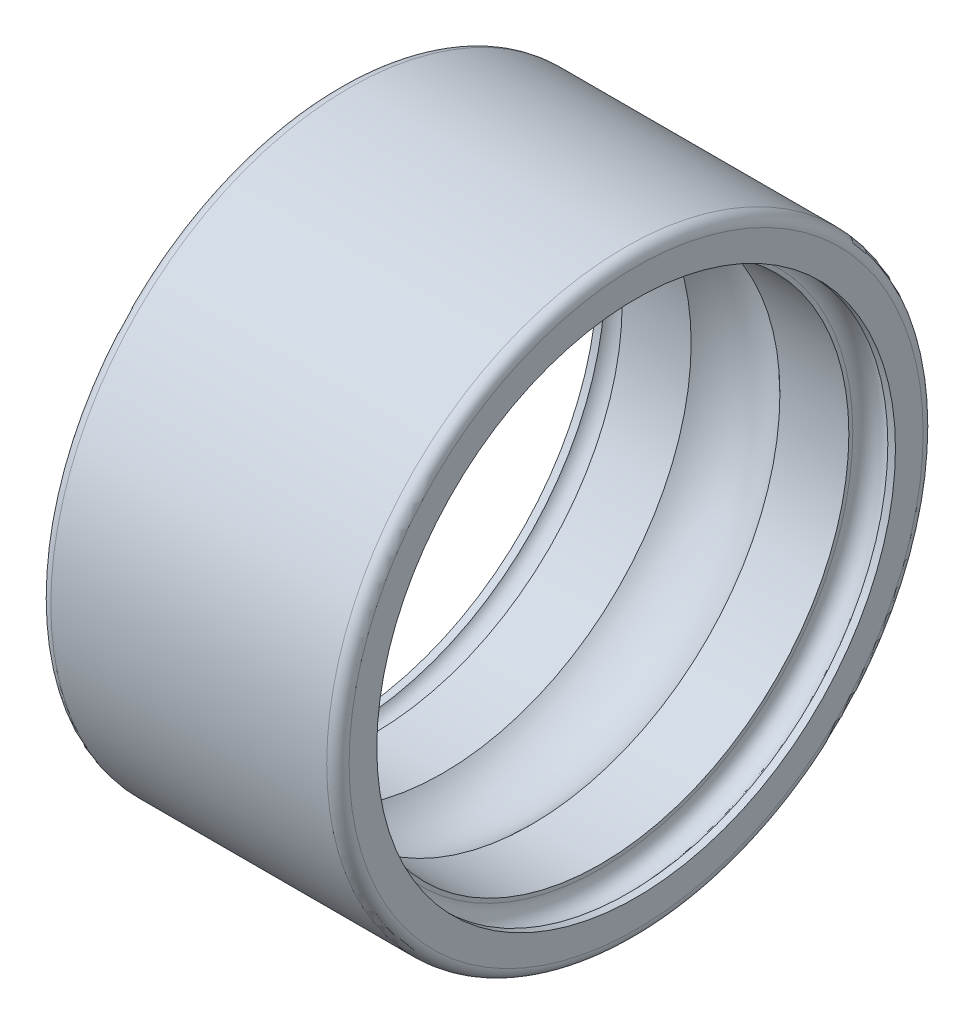
ISO-10303-21;
HEADER;
FILE_DESCRIPTION(('STEP AP214'),'2;1');
FILE_NAME('part.step','',(''),(''),'','','');
FILE_SCHEMA(('AUTOMOTIVE_DESIGN { 1 0 10303 214 1 1 1 1 }'));
ENDSEC;
DATA;
#1=APPLICATION_CONTEXT('core data for automotive mechanical design processes');
#2=APPLICATION_PROTOCOL_DEFINITION('international standard','automotive_design',2000,#1);
#3=PRODUCT_CONTEXT('',#1,'mechanical');
#4=PRODUCT('Part','Part','',(#3));
#5=PRODUCT_RELATED_PRODUCT_CATEGORY('part','',(#4));
#6=PRODUCT_DEFINITION_FORMATION('','',#4);
#7=PRODUCT_DEFINITION_CONTEXT('part definition',#1,'design');
#8=PRODUCT_DEFINITION('design','',#6,#7);
#9=PRODUCT_DEFINITION_SHAPE('','',#8);
#10=(LENGTH_UNIT() NAMED_UNIT(*) SI_UNIT(.MILLI.,.METRE.));
#11=(NAMED_UNIT(*) PLANE_ANGLE_UNIT() SI_UNIT($,.RADIAN.));
#12=(NAMED_UNIT(*) SI_UNIT($,.STERADIAN.) SOLID_ANGLE_UNIT());
#13=UNCERTAINTY_MEASURE_WITH_UNIT(LENGTH_MEASURE(1.E-05),#10,'distance_accuracy_value','');
#14=(GEOMETRIC_REPRESENTATION_CONTEXT(3) GLOBAL_UNCERTAINTY_ASSIGNED_CONTEXT((#13)) GLOBAL_UNIT_ASSIGNED_CONTEXT((#10,
#11,#12)) REPRESENTATION_CONTEXT('',''));
#15=CARTESIAN_POINT('',(0.,0.,0.));
#16=DIRECTION('',(0.,0.,1.));
#17=DIRECTION('',(1.,0.,0.));
#18=AXIS2_PLACEMENT_3D('',#15,#16,#17);
#19=CARTESIAN_POINT('',(0.,0.,0.));
#20=DIRECTION('',(-1.,0.,0.));
#21=DIRECTION('',(0.,0.,1.));
#22=AXIS2_PLACEMENT_3D('',#19,#20,#21);
#23=CYLINDRICAL_SURFACE('',#22,3.33333333333333);
#24=CARTESIAN_POINT('',(2.5951190357119,0.,0.));
#25=DIRECTION('',(-1.,0.,0.));
#26=DIRECTION('',(0.,0.,1.));
#27=AXIS2_PLACEMENT_3D('',#24,#25,#26);
#28=CIRCLE('',#27,3.33333333333333);
#29=CARTESIAN_POINT('',(2.5951190357119,0.,3.33333333333333));
#30=VERTEX_POINT('',#29);
#31=EDGE_CURVE('E45',#30,#30,#28,.T.);
#32=ORIENTED_EDGE('',*,*,#31,.T.);
#33=EDGE_LOOP('',(#32));
#34=FACE_BOUND('',#33,.T.);
#35=CARTESIAN_POINT('',(3.52,0.,0.));
#36=DIRECTION('',(1.,0.,0.));
#37=DIRECTION('',(0.,0.,-1.));
#38=AXIS2_PLACEMENT_3D('',#35,#36,#37);
#39=CIRCLE('',#38,3.33333333333333);
#40=CARTESIAN_POINT('',(3.52,0.,-3.33333333333333));
#41=VERTEX_POINT('',#40);
#42=EDGE_CURVE('E18',#41,#41,#39,.T.);
#43=ORIENTED_EDGE('',*,*,#42,.T.);
#44=EDGE_LOOP('',(#43));
#45=FACE_BOUND('',#44,.T.);
#46=ADVANCED_FACE('F15',(#34,#45),#23,.F.);
#47=CARTESIAN_POINT('',(0.,0.,0.));
#48=DIRECTION('',(-1.,0.,0.));
#49=DIRECTION('',(0.,0.,1.));
#50=AXIS2_PLACEMENT_3D('',#47,#48,#49);
#51=CYLINDRICAL_SURFACE('',#50,3.33333333333333);
#52=CARTESIAN_POINT('',(1.4048809642881,0.,0.));
#53=DIRECTION('',(-1.,0.,0.));
#54=DIRECTION('',(0.,0.,1.));
#55=AXIS2_PLACEMENT_3D('',#52,#53,#54);
#56=CIRCLE('',#55,3.33333333333333);
#57=CARTESIAN_POINT('',(1.4048809642881,0.,3.33333333333333));
#58=VERTEX_POINT('',#57);
#59=EDGE_CURVE('E78',#58,#58,#56,.T.);
#60=ORIENTED_EDGE('',*,*,#59,.F.);
#61=EDGE_LOOP('',(#60));
#62=FACE_BOUND('',#61,.T.);
#63=CARTESIAN_POINT('',(0.48,0.,0.));
#64=DIRECTION('',(-1.,0.,0.));
#65=DIRECTION('',(0.,0.,1.));
#66=AXIS2_PLACEMENT_3D('',#63,#64,#65);
#67=CIRCLE('',#66,3.33333333333333);
#68=CARTESIAN_POINT('',(0.48,0.,3.33333333333333));
#69=VERTEX_POINT('',#68);
#70=EDGE_CURVE('E37',#69,#69,#67,.F.);
#71=ORIENTED_EDGE('',*,*,#70,.F.);
#72=EDGE_LOOP('',(#71));
#73=FACE_BOUND('',#72,.T.);
#74=ADVANCED_FACE('F108',(#62,#73),#51,.F.);
#75=CARTESIAN_POINT('',(4.,3.33333333333333,0.));
#76=DIRECTION('',(-1.,0.,0.));
#77=DIRECTION('',(0.,0.,1.));
#78=AXIS2_PLACEMENT_3D('',#75,#76,#77);
#79=PLANE('',#78);
#80=CARTESIAN_POINT('',(4.,0.,0.));
#81=DIRECTION('',(-1.,0.,0.));
#82=DIRECTION('',(0.,0.,1.));
#83=AXIS2_PLACEMENT_3D('',#80,#81,#82);
#84=CIRCLE('',#83,3.47833333333333);
#85=CARTESIAN_POINT('',(4.,0.,3.47833333333334));
#86=VERTEX_POINT('',#85);
#87=EDGE_CURVE('E46',#86,#86,#84,.T.);
#88=ORIENTED_EDGE('',*,*,#87,.T.);
#89=EDGE_LOOP('',(#88));
#90=FACE_BOUND('',#89,.T.);
#91=CARTESIAN_POINT('',(4.,0.,0.));
#92=DIRECTION('',(-1.,0.,0.));
#93=DIRECTION('',(0.,0.,1.));
#94=AXIS2_PLACEMENT_3D('',#91,#92,#93);
#95=CIRCLE('',#94,3.85);
#96=CARTESIAN_POINT('',(4.,0.,3.85));
#97=VERTEX_POINT('',#96);
#98=EDGE_CURVE('E10',#97,#97,#95,.T.);
#99=ORIENTED_EDGE('',*,*,#98,.F.);
#100=EDGE_LOOP('',(#99));
#101=FACE_BOUND('',#100,.T.);
#102=ADVANCED_FACE('F102',(#90,#101),#79,.F.);
#103=CARTESIAN_POINT('',(3.85,0.,0.));
#104=DIRECTION('',(-1.,0.,0.));
#105=DIRECTION('',(0.,0.,1.));
#106=AXIS2_PLACEMENT_3D('',#103,#104,#105);
#107=TOROIDAL_SURFACE('',#106,3.85,0.15);
#108=CARTESIAN_POINT('',(3.85,0.,0.));
#109=DIRECTION('',(-1.,0.,0.));
#110=DIRECTION('',(0.,0.,1.));
#111=AXIS2_PLACEMENT_3D('',#108,#109,#110);
#112=CIRCLE('',#111,4.);
#113=CARTESIAN_POINT('',(3.85,0.,4.));
#114=VERTEX_POINT('',#113);
#115=EDGE_CURVE('E23',#114,#114,#112,.T.);
#116=ORIENTED_EDGE('',*,*,#115,.F.);
#117=EDGE_LOOP('',(#116));
#118=FACE_BOUND('',#117,.T.);
#119=ORIENTED_EDGE('',*,*,#98,.T.);
#120=EDGE_LOOP('',(#119));
#121=FACE_BOUND('',#120,.T.);
#122=ADVANCED_FACE('F97',(#118,#121),#107,.T.);
#123=CARTESIAN_POINT('',(0.,0.,0.));
#124=DIRECTION('',(-1.,0.,0.));
#125=DIRECTION('',(0.,0.,1.));
#126=AXIS2_PLACEMENT_3D('',#123,#124,#125);
#127=CYLINDRICAL_SURFACE('',#126,4.);
#128=CARTESIAN_POINT('',(0.15,0.,0.));
#129=DIRECTION('',(-1.,0.,0.));
#130=DIRECTION('',(0.,0.,1.));
#131=AXIS2_PLACEMENT_3D('',#128,#129,#130);
#132=CIRCLE('',#131,4.);
#133=CARTESIAN_POINT('',(0.15,0.,4.));
#134=VERTEX_POINT('',#133);
#135=EDGE_CURVE('E33',#134,#134,#132,.T.);
#136=ORIENTED_EDGE('',*,*,#135,.F.);
#137=EDGE_LOOP('',(#136));
#138=FACE_BOUND('',#137,.T.);
#139=ORIENTED_EDGE('',*,*,#115,.T.);
#140=EDGE_LOOP('',(#139));
#141=FACE_BOUND('',#140,.T.);
#142=ADVANCED_FACE('F94',(#138,#141),#127,.T.);
#143=CARTESIAN_POINT('',(0.15,0.,0.));
#144=DIRECTION('',(-1.,0.,0.));
#145=DIRECTION('',(0.,0.,1.));
#146=AXIS2_PLACEMENT_3D('',#143,#144,#145);
#147=TOROIDAL_SURFACE('',#146,3.85,0.15);
#148=CARTESIAN_POINT('',(0.,0.,0.));
#149=DIRECTION('',(-1.,0.,0.));
#150=DIRECTION('',(0.,0.,1.));
#151=AXIS2_PLACEMENT_3D('',#148,#149,#150);
#152=CIRCLE('',#151,3.85);
#153=CARTESIAN_POINT('',(0.,0.,3.85));
#154=VERTEX_POINT('',#153);
#155=EDGE_CURVE('E82',#154,#154,#152,.T.);
#156=ORIENTED_EDGE('',*,*,#155,.F.);
#157=EDGE_LOOP('',(#156));
#158=FACE_BOUND('',#157,.T.);
#159=ORIENTED_EDGE('',*,*,#135,.T.);
#160=EDGE_LOOP('',(#159));
#161=FACE_BOUND('',#160,.T.);
#162=ADVANCED_FACE('F92',(#158,#161),#147,.T.);
#163=CARTESIAN_POINT('',(0.,3.33333333333333,0.));
#164=DIRECTION('',(-1.,0.,0.));
#165=DIRECTION('',(0.,0.,1.));
#166=AXIS2_PLACEMENT_3D('',#163,#164,#165);
#167=PLANE('',#166);
#168=CARTESIAN_POINT('',(0.,0.,0.));
#169=DIRECTION('',(-1.,0.,0.));
#170=DIRECTION('',(0.,0.,1.));
#171=AXIS2_PLACEMENT_3D('',#168,#169,#170);
#172=CIRCLE('',#171,3.47833333333333);
#173=CARTESIAN_POINT('',(0.,0.,3.47833333333333));
#174=VERTEX_POINT('',#173);
#175=EDGE_CURVE('E41',#174,#174,#172,.T.);
#176=ORIENTED_EDGE('',*,*,#175,.F.);
#177=EDGE_LOOP('',(#176));
#178=FACE_BOUND('',#177,.T.);
#179=ORIENTED_EDGE('',*,*,#155,.T.);
#180=EDGE_LOOP('',(#179));
#181=FACE_BOUND('',#180,.T.);
#182=ADVANCED_FACE('F148',(#178,#181),#167,.T.);
#183=CARTESIAN_POINT('',(2.,0.,0.));
#184=DIRECTION('',(-1.,0.,0.));
#185=DIRECTION('',(0.,0.,1.));
#186=AXIS2_PLACEMENT_3D('',#183,#184,#185);
#187=TOROIDAL_SURFACE('',#186,2.75,0.833333333333334);
#188=ORIENTED_EDGE('',*,*,#59,.T.);
#189=EDGE_LOOP('',(#188));
#190=FACE_BOUND('',#189,.T.);
#191=ORIENTED_EDGE('',*,*,#31,.F.);
#192=EDGE_LOOP('',(#191));
#193=FACE_BOUND('',#192,.T.);
#194=ADVANCED_FACE('F145',(#190,#193),#187,.F.);
#195=CARTESIAN_POINT('',(0.48,2.25189739793884,0.));
#196=DIRECTION('',(-1.,0.,0.));
#197=DIRECTION('',(0.,0.,1.));
#198=AXIS2_PLACEMENT_3D('',#195,#196,#197);
#199=PLANE('',#198);
#200=CARTESIAN_POINT('',(0.48,0.,0.));
#201=DIRECTION('',(-1.,0.,0.));
#202=DIRECTION('',(0.,0.,1.));
#203=AXIS2_PLACEMENT_3D('',#200,#201,#202);
#204=CIRCLE('',#203,3.38633333333333);
#205=CARTESIAN_POINT('',(0.48,0.,3.38633333333333));
#206=VERTEX_POINT('',#205);
#207=EDGE_CURVE('E42',#206,#206,#204,.T.);
#208=ORIENTED_EDGE('',*,*,#207,.T.);
#209=EDGE_LOOP('',(#208));
#210=FACE_BOUND('',#209,.T.);
#211=ORIENTED_EDGE('',*,*,#70,.T.);
#212=EDGE_LOOP('',(#211));
#213=FACE_BOUND('',#212,.T.);
#214=ADVANCED_FACE('F141',(#210,#213),#199,.T.);
#215=CARTESIAN_POINT('',(0.28,0.,0.));
#216=DIRECTION('',(-1.,0.,0.));
#217=DIRECTION('',(0.,0.,1.));
#218=AXIS2_PLACEMENT_3D('',#215,#216,#217);
#219=TOROIDAL_SURFACE('',#218,3.38633333333333,0.2);
#220=CARTESIAN_POINT('',(0.102416216956615,0.,0.));
#221=DIRECTION('',(-1.,0.,0.));
#222=DIRECTION('',(0.,0.,1.));
#223=AXIS2_PLACEMENT_3D('',#220,#221,#222);
#224=CIRCLE('',#223,3.47833333333333);
#225=CARTESIAN_POINT('',(0.102416216956615,0.,3.47833333333333));
#226=VERTEX_POINT('',#225);
#227=EDGE_CURVE('E55',#226,#226,#224,.T.);
#228=ORIENTED_EDGE('',*,*,#227,.T.);
#229=EDGE_LOOP('',(#228));
#230=FACE_BOUND('',#229,.T.);
#231=ORIENTED_EDGE('',*,*,#207,.F.);
#232=EDGE_LOOP('',(#231));
#233=FACE_BOUND('',#232,.T.);
#234=ADVANCED_FACE('F137',(#230,#233),#219,.F.);
#235=CARTESIAN_POINT('',(-1.,0.,0.));
#236=DIRECTION('',(-1.,0.,0.));
#237=DIRECTION('',(0.,0.,1.));
#238=AXIS2_PLACEMENT_3D('',#235,#236,#237);
#239=CYLINDRICAL_SURFACE('',#238,3.47833333333333);
#240=ORIENTED_EDGE('',*,*,#175,.T.);
#241=EDGE_LOOP('',(#240));
#242=FACE_BOUND('',#241,.T.);
#243=ORIENTED_EDGE('',*,*,#227,.F.);
#244=EDGE_LOOP('',(#243));
#245=FACE_BOUND('',#244,.T.);
#246=ADVANCED_FACE('F131',(#242,#245),#239,.F.);
#247=CARTESIAN_POINT('',(5.,0.,0.));
#248=DIRECTION('',(1.,0.,0.));
#249=DIRECTION('',(0.,0.,-1.));
#250=AXIS2_PLACEMENT_3D('',#247,#248,#249);
#251=CYLINDRICAL_SURFACE('',#250,3.47833333333333);
#252=CARTESIAN_POINT('',(3.89758378304338,0.,0.));
#253=DIRECTION('',(1.,0.,0.));
#254=DIRECTION('',(0.,0.,-1.));
#255=AXIS2_PLACEMENT_3D('',#252,#253,#254);
#256=CIRCLE('',#255,3.47833333333333);
#257=CARTESIAN_POINT('',(3.89758378304339,0.,-3.47833333333333));
#258=VERTEX_POINT('',#257);
#259=EDGE_CURVE('E58',#258,#258,#256,.T.);
#260=ORIENTED_EDGE('',*,*,#259,.F.);
#261=EDGE_LOOP('',(#260));
#262=FACE_BOUND('',#261,.T.);
#263=ORIENTED_EDGE('',*,*,#87,.F.);
#264=EDGE_LOOP('',(#263));
#265=FACE_BOUND('',#264,.T.);
#266=ADVANCED_FACE('F123',(#262,#265),#251,.F.);
#267=CARTESIAN_POINT('',(3.52,2.25189739793884,0.));
#268=DIRECTION('',(1.,0.,0.));
#269=DIRECTION('',(0.,0.,-1.));
#270=AXIS2_PLACEMENT_3D('',#267,#268,#269);
#271=PLANE('',#270);
#272=ORIENTED_EDGE('',*,*,#42,.F.);
#273=EDGE_LOOP('',(#272));
#274=FACE_BOUND('',#273,.T.);
#275=CARTESIAN_POINT('',(3.52,0.,0.));
#276=DIRECTION('',(1.,0.,0.));
#277=DIRECTION('',(0.,0.,-1.));
#278=AXIS2_PLACEMENT_3D('',#275,#276,#277);
#279=CIRCLE('',#278,3.38633333333333);
#280=CARTESIAN_POINT('',(3.52,0.,-3.38633333333333));
#281=VERTEX_POINT('',#280);
#282=EDGE_CURVE('E48',#281,#281,#279,.T.);
#283=ORIENTED_EDGE('',*,*,#282,.T.);
#284=EDGE_LOOP('',(#283));
#285=FACE_BOUND('',#284,.T.);
#286=ADVANCED_FACE('F120',(#274,#285),#271,.T.);
#287=CARTESIAN_POINT('',(3.72,0.,0.));
#288=DIRECTION('',(1.,0.,0.));
#289=DIRECTION('',(0.,0.,-1.));
#290=AXIS2_PLACEMENT_3D('',#287,#288,#289);
#291=TOROIDAL_SURFACE('',#290,3.38633333333333,0.2);
#292=ORIENTED_EDGE('',*,*,#259,.T.);
#293=EDGE_LOOP('',(#292));
#294=FACE_BOUND('',#293,.T.);
#295=ORIENTED_EDGE('',*,*,#282,.F.);
#296=EDGE_LOOP('',(#295));
#297=FACE_BOUND('',#296,.T.);
#298=ADVANCED_FACE('F122',(#294,#297),#291,.F.);
#299=CLOSED_SHELL('',(#46,#74,#102,#122,#142,#162,#182,#194,#214,#234,#246,#266,#286,#298));
#300=MANIFOLD_SOLID_BREP('B1',#299);
#301=ADVANCED_BREP_SHAPE_REPRESENTATION('',(#18,#300),#14);
#302=SHAPE_DEFINITION_REPRESENTATION(#9,#301);
ENDSEC;
END-ISO-10303-21;
